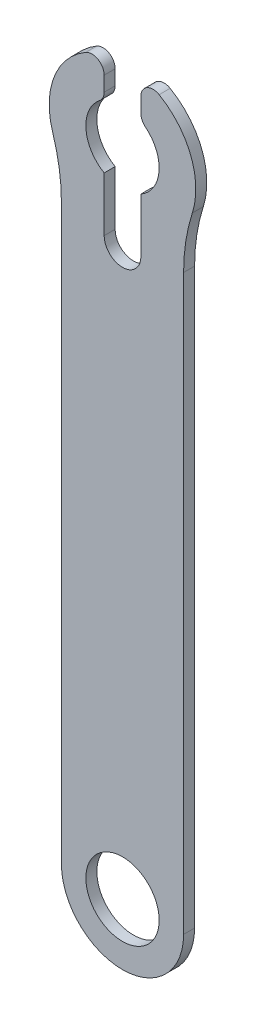
ISO-10303-21;
HEADER;
FILE_DESCRIPTION(('STEP AP214'),'2;1');
FILE_NAME('part.step','',(''),(''),'','','');
FILE_SCHEMA(('AUTOMOTIVE_DESIGN { 1 0 10303 214 1 1 1 1 }'));
ENDSEC;
DATA;
#1=APPLICATION_CONTEXT('core data for automotive mechanical design processes');
#2=APPLICATION_PROTOCOL_DEFINITION('international standard','automotive_design',2000,#1);
#3=PRODUCT_CONTEXT('',#1,'mechanical');
#4=PRODUCT('Part','Part','',(#3));
#5=PRODUCT_RELATED_PRODUCT_CATEGORY('part','',(#4));
#6=PRODUCT_DEFINITION_FORMATION('','',#4);
#7=PRODUCT_DEFINITION_CONTEXT('part definition',#1,'design');
#8=PRODUCT_DEFINITION('design','',#6,#7);
#9=PRODUCT_DEFINITION_SHAPE('','',#8);
#10=(LENGTH_UNIT() NAMED_UNIT(*) SI_UNIT(.MILLI.,.METRE.));
#11=(NAMED_UNIT(*) PLANE_ANGLE_UNIT() SI_UNIT($,.RADIAN.));
#12=(NAMED_UNIT(*) SI_UNIT($,.STERADIAN.) SOLID_ANGLE_UNIT());
#13=UNCERTAINTY_MEASURE_WITH_UNIT(LENGTH_MEASURE(1.E-05),#10,'distance_accuracy_value','');
#14=(GEOMETRIC_REPRESENTATION_CONTEXT(3) GLOBAL_UNCERTAINTY_ASSIGNED_CONTEXT((#13)) GLOBAL_UNIT_ASSIGNED_CONTEXT((#10,
#11,#12)) REPRESENTATION_CONTEXT('',''));
#15=CARTESIAN_POINT('',(0.,0.,0.));
#16=DIRECTION('',(0.,0.,1.));
#17=DIRECTION('',(1.,0.,0.));
#18=AXIS2_PLACEMENT_3D('',#15,#16,#17);
#19=CARTESIAN_POINT('',(0.,-7.04210447024836,0.9));
#20=DIRECTION('',(0.,0.,-1.));
#21=DIRECTION('',(-1.,0.,0.));
#22=AXIS2_PLACEMENT_3D('',#19,#20,#21);
#23=CYLINDRICAL_SURFACE('',#22,1.5);
#24=CARTESIAN_POINT('',(0.,-7.04210447024836,0.));
#25=DIRECTION('',(0.,0.,1.));
#26=DIRECTION('',(1.,0.,0.));
#27=AXIS2_PLACEMENT_3D('',#24,#25,#26);
#28=CIRCLE('',#27,1.5);
#29=CARTESIAN_POINT('',(-1.5,-7.04210447024836,0.));
#30=VERTEX_POINT('',#29);
#31=CARTESIAN_POINT('',(1.5,-7.04210447024836,0.));
#32=VERTEX_POINT('',#31);
#33=EDGE_CURVE('E168',#30,#32,#28,.T.);
#34=ORIENTED_EDGE('',*,*,#33,.F.);
#35=DIRECTION('',(0.,0.,-1.));
#36=VECTOR('',#35,1.);
#37=CARTESIAN_POINT('',(-1.5,-7.04210447024836,0.9));
#38=LINE('',#37,#36);
#39=CARTESIAN_POINT('',(-1.5,-7.04210447024836,0.9));
#40=VERTEX_POINT('',#39);
#41=EDGE_CURVE('E167',#40,#30,#38,.T.);
#42=ORIENTED_EDGE('',*,*,#41,.F.);
#43=CARTESIAN_POINT('',(0.,-7.04210447024836,0.9));
#44=DIRECTION('',(0.,0.,1.));
#45=DIRECTION('',(1.,0.,0.));
#46=AXIS2_PLACEMENT_3D('',#43,#44,#45);
#47=CIRCLE('',#46,1.5);
#48=CARTESIAN_POINT('',(1.5,-7.04210447024836,0.9));
#49=VERTEX_POINT('',#48);
#50=EDGE_CURVE('E169',#40,#49,#47,.T.);
#51=ORIENTED_EDGE('',*,*,#50,.T.);
#52=DIRECTION('',(0.,0.,-1.));
#53=VECTOR('',#52,1.);
#54=CARTESIAN_POINT('',(1.5,-7.04210447024836,0.9));
#55=LINE('',#54,#53);
#56=EDGE_CURVE('E217',#49,#32,#55,.T.);
#57=ORIENTED_EDGE('',*,*,#56,.T.);
#58=EDGE_LOOP('',(#34,#42,#51,#57));
#59=FACE_BOUND('',#58,.T.);
#60=ADVANCED_FACE('F39',(#59),#23,.F.);
#61=CARTESIAN_POINT('',(-1.5,0.,0.9));
#62=DIRECTION('',(1.,0.,0.));
#63=DIRECTION('',(0.,1.,0.));
#64=AXIS2_PLACEMENT_3D('',#61,#62,#63);
#65=PLANE('',#64);
#66=DIRECTION('',(0.,-1.,0.));
#67=VECTOR('',#66,1.);
#68=CARTESIAN_POINT('',(-1.5,0.,0.));
#69=LINE('',#68,#67);
#70=CARTESIAN_POINT('',(-1.5,-2.59807621135332,0.));
#71=VERTEX_POINT('',#70);
#72=EDGE_CURVE('E219',#71,#30,#69,.T.);
#73=ORIENTED_EDGE('',*,*,#72,.F.);
#74=DIRECTION('',(0.,0.,-1.));
#75=VECTOR('',#74,1.);
#76=CARTESIAN_POINT('',(-1.5,-2.59807621135332,0.9));
#77=LINE('',#76,#75);
#78=CARTESIAN_POINT('',(-1.5,-2.59807621135332,0.9));
#79=VERTEX_POINT('',#78);
#80=EDGE_CURVE('E176',#79,#71,#77,.T.);
#81=ORIENTED_EDGE('',*,*,#80,.F.);
#82=DIRECTION('',(0.,-1.,0.));
#83=VECTOR('',#82,1.);
#84=CARTESIAN_POINT('',(-1.5,0.,0.9));
#85=LINE('',#84,#83);
#86=EDGE_CURVE('E181',#79,#40,#85,.T.);
#87=ORIENTED_EDGE('',*,*,#86,.T.);
#88=ORIENTED_EDGE('',*,*,#41,.T.);
#89=EDGE_LOOP('',(#73,#81,#87,#88));
#90=FACE_BOUND('',#89,.T.);
#91=ADVANCED_FACE('F191',(#90),#65,.T.);
#92=CARTESIAN_POINT('',(0.,0.,0.9));
#93=DIRECTION('',(0.,0.,-1.));
#94=DIRECTION('',(-1.,0.,0.));
#95=AXIS2_PLACEMENT_3D('',#92,#93,#94);
#96=CYLINDRICAL_SURFACE('',#95,3.);
#97=CARTESIAN_POINT('',(0.,0.,0.));
#98=DIRECTION('',(0.,0.,1.));
#99=DIRECTION('',(1.,0.,0.));
#100=AXIS2_PLACEMENT_3D('',#97,#98,#99);
#101=CIRCLE('',#100,3.);
#102=CARTESIAN_POINT('',(-1.875,2.3418742493994,0.));
#103=VERTEX_POINT('',#102);
#104=EDGE_CURVE('E225',#103,#71,#101,.T.);
#105=ORIENTED_EDGE('',*,*,#104,.F.);
#106=DIRECTION('',(0.,0.,-1.));
#107=VECTOR('',#106,1.);
#108=CARTESIAN_POINT('',(-1.875,2.3418742493994,0.9));
#109=LINE('',#108,#107);
#110=CARTESIAN_POINT('',(-1.875,2.3418742493994,0.9));
#111=VERTEX_POINT('',#110);
#112=EDGE_CURVE('E303',#103,#111,#109,.F.);
#113=ORIENTED_EDGE('',*,*,#112,.T.);
#114=CARTESIAN_POINT('',(0.,0.,0.9));
#115=DIRECTION('',(0.,0.,1.));
#116=DIRECTION('',(1.,0.,0.));
#117=AXIS2_PLACEMENT_3D('',#114,#115,#116);
#118=CIRCLE('',#117,3.);
#119=EDGE_CURVE('E192',#111,#79,#118,.T.);
#120=ORIENTED_EDGE('',*,*,#119,.T.);
#121=ORIENTED_EDGE('',*,*,#80,.T.);
#122=EDGE_LOOP('',(#105,#113,#120,#121));
#123=FACE_BOUND('',#122,.T.);
#124=ADVANCED_FACE('F306',(#123),#96,.F.);
#125=CARTESIAN_POINT('',(-1.5,0.,0.9));
#126=DIRECTION('',(1.,0.,0.));
#127=DIRECTION('',(0.,1.,0.));
#128=AXIS2_PLACEMENT_3D('',#125,#126,#127);
#129=PLANE('',#128);
#130=DIRECTION('',(0.,-1.,0.));
#131=VECTOR('',#130,1.);
#132=CARTESIAN_POINT('',(-1.5,0.,0.9));
#133=LINE('',#132,#131);
#134=CARTESIAN_POINT('',(-1.5,4.3301270189222,0.9));
#135=VERTEX_POINT('',#134);
#136=CARTESIAN_POINT('',(-1.5,3.1224989991992,0.9));
#137=VERTEX_POINT('',#136);
#138=EDGE_CURVE('E194',#135,#137,#133,.T.);
#139=ORIENTED_EDGE('',*,*,#138,.T.);
#140=DIRECTION('',(0.,0.,-1.));
#141=VECTOR('',#140,1.);
#142=CARTESIAN_POINT('',(-1.5,3.1224989991992,0.9));
#143=LINE('',#142,#141);
#144=CARTESIAN_POINT('',(-1.5,3.1224989991992,0.));
#145=VERTEX_POINT('',#144);
#146=EDGE_CURVE('E301',#137,#145,#143,.T.);
#147=ORIENTED_EDGE('',*,*,#146,.T.);
#148=DIRECTION('',(0.,-1.,0.));
#149=VECTOR('',#148,1.);
#150=CARTESIAN_POINT('',(-1.5,0.,0.));
#151=LINE('',#150,#149);
#152=CARTESIAN_POINT('',(-1.5,4.3301270189222,0.));
#153=VERTEX_POINT('',#152);
#154=EDGE_CURVE('E221',#153,#145,#151,.T.);
#155=ORIENTED_EDGE('',*,*,#154,.F.);
#156=DIRECTION('',(0.,0.,1.));
#157=VECTOR('',#156,1.);
#158=CARTESIAN_POINT('',(-1.5,4.3301270189222,0.9));
#159=LINE('',#158,#157);
#160=EDGE_CURVE('E296',#153,#135,#159,.T.);
#161=ORIENTED_EDGE('',*,*,#160,.T.);
#162=EDGE_LOOP('',(#139,#147,#155,#161));
#163=FACE_BOUND('',#162,.T.);
#164=ADVANCED_FACE('F312',(#163),#129,.T.);
#165=CARTESIAN_POINT('',(0.,0.,0.9));
#166=DIRECTION('',(0.,0.,-1.));
#167=DIRECTION('',(-1.,0.,0.));
#168=AXIS2_PLACEMENT_3D('',#165,#166,#167);
#169=CYLINDRICAL_SURFACE('',#168,6.);
#170=CARTESIAN_POINT('',(0.,0.,0.9));
#171=DIRECTION('',(0.,0.,1.));
#172=DIRECTION('',(1.,0.,0.));
#173=AXIS2_PLACEMENT_3D('',#170,#171,#172);
#174=CIRCLE('',#173,6.);
#175=CARTESIAN_POINT('',(-3.,5.19615242270663,0.9));
#176=VERTEX_POINT('',#175);
#177=CARTESIAN_POINT('',(-5.71428571428572,-1.82946406783796,0.9));
#178=VERTEX_POINT('',#177);
#179=EDGE_CURVE('E203',#176,#178,#174,.T.);
#180=ORIENTED_EDGE('',*,*,#179,.F.);
#181=DIRECTION('',(0.,0.,-1.));
#182=VECTOR('',#181,1.);
#183=CARTESIAN_POINT('',(-3.,5.19615242270663,0.9));
#184=LINE('',#183,#182);
#185=CARTESIAN_POINT('',(-3.,5.19615242270663,0.));
#186=VERTEX_POINT('',#185);
#187=EDGE_CURVE('E11',#176,#186,#184,.T.);
#188=ORIENTED_EDGE('',*,*,#187,.T.);
#189=CARTESIAN_POINT('',(0.,0.,0.));
#190=DIRECTION('',(0.,0.,1.));
#191=DIRECTION('',(1.,0.,0.));
#192=AXIS2_PLACEMENT_3D('',#189,#190,#191);
#193=CIRCLE('',#192,6.);
#194=CARTESIAN_POINT('',(-5.71428571428572,-1.82946406783796,0.));
#195=VERTEX_POINT('',#194);
#196=EDGE_CURVE('E230',#186,#195,#193,.T.);
#197=ORIENTED_EDGE('',*,*,#196,.T.);
#198=DIRECTION('',(0.,0.,-1.));
#199=VECTOR('',#198,1.);
#200=CARTESIAN_POINT('',(-5.71428571428572,-1.82946406783796,0.9));
#201=LINE('',#200,#199);
#202=EDGE_CURVE('E262',#195,#178,#201,.F.);
#203=ORIENTED_EDGE('',*,*,#202,.T.);
#204=EDGE_LOOP('',(#180,#188,#197,#203));
#205=FACE_BOUND('',#204,.T.);
#206=ADVANCED_FACE('F324',(#205),#169,.T.);
#207=CARTESIAN_POINT('',(-5.,0.,0.9));
#208=DIRECTION('',(1.,0.,0.));
#209=DIRECTION('',(0.,1.,0.));
#210=AXIS2_PLACEMENT_3D('',#207,#208,#209);
#211=PLANE('',#210);
#212=DIRECTION('',(0.,-1.,0.));
#213=VECTOR('',#212,1.);
#214=CARTESIAN_POINT('',(-5.,0.,0.9));
#215=LINE('',#214,#213);
#216=CARTESIAN_POINT('',(-5.,-6.40312423743285,0.9));
#217=VERTEX_POINT('',#216);
#218=CARTESIAN_POINT('',(-4.99999999999999,-53.3166247903554,0.9));
#219=VERTEX_POINT('',#218);
#220=EDGE_CURVE('E201',#217,#219,#215,.T.);
#221=ORIENTED_EDGE('',*,*,#220,.F.);
#222=DIRECTION('',(0.,0.,1.));
#223=VECTOR('',#222,1.);
#224=CARTESIAN_POINT('',(-5.,-6.40312423743285,0.));
#225=LINE('',#224,#223);
#226=CARTESIAN_POINT('',(-5.,-6.40312423743285,0.));
#227=VERTEX_POINT('',#226);
#228=EDGE_CURVE('E261',#217,#227,#225,.F.);
#229=ORIENTED_EDGE('',*,*,#228,.T.);
#230=DIRECTION('',(0.,-1.,0.));
#231=VECTOR('',#230,1.);
#232=CARTESIAN_POINT('',(-5.,0.,0.));
#233=LINE('',#232,#231);
#234=CARTESIAN_POINT('',(-4.99999999999999,-53.3166247903554,0.));
#235=VERTEX_POINT('',#234);
#236=EDGE_CURVE('E228',#227,#235,#233,.T.);
#237=ORIENTED_EDGE('',*,*,#236,.T.);
#238=DIRECTION('',(0.,0.,-1.));
#239=VECTOR('',#238,1.);
#240=CARTESIAN_POINT('',(-4.99999999999999,-53.3166247903554,0.9));
#241=LINE('',#240,#239);
#242=EDGE_CURVE('E251',#219,#235,#241,.T.);
#243=ORIENTED_EDGE('',*,*,#242,.F.);
#244=EDGE_LOOP('',(#221,#229,#237,#243));
#245=FACE_BOUND('',#244,.T.);
#246=ADVANCED_FACE('F334',(#245),#211,.F.);
#247=CARTESIAN_POINT('',(0.,-53.3166247903554,0.9));
#248=DIRECTION('',(0.,0.,-1.));
#249=DIRECTION('',(-1.,0.,0.));
#250=AXIS2_PLACEMENT_3D('',#247,#248,#249);
#251=CYLINDRICAL_SURFACE('',#250,4.99999999999999);
#252=CARTESIAN_POINT('',(0.,-53.3166247903554,0.));
#253=DIRECTION('',(0.,0.,1.));
#254=DIRECTION('',(1.,0.,0.));
#255=AXIS2_PLACEMENT_3D('',#252,#253,#254);
#256=CIRCLE('',#255,4.99999999999999);
#257=CARTESIAN_POINT('',(4.99999999999999,-53.3166247903554,0.));
#258=VERTEX_POINT('',#257);
#259=EDGE_CURVE('E235',#235,#258,#256,.T.);
#260=ORIENTED_EDGE('',*,*,#259,.T.);
#261=DIRECTION('',(0.,0.,-1.));
#262=VECTOR('',#261,1.);
#263=CARTESIAN_POINT('',(4.99999999999999,-53.3166247903554,0.9));
#264=LINE('',#263,#262);
#265=CARTESIAN_POINT('',(4.99999999999999,-53.3166247903554,0.9));
#266=VERTEX_POINT('',#265);
#267=EDGE_CURVE('E249',#266,#258,#264,.T.);
#268=ORIENTED_EDGE('',*,*,#267,.F.);
#269=CARTESIAN_POINT('',(0.,-53.3166247903554,0.9));
#270=DIRECTION('',(0.,0.,1.));
#271=DIRECTION('',(1.,0.,0.));
#272=AXIS2_PLACEMENT_3D('',#269,#270,#271);
#273=CIRCLE('',#272,4.99999999999999);
#274=EDGE_CURVE('E202',#219,#266,#273,.T.);
#275=ORIENTED_EDGE('',*,*,#274,.F.);
#276=ORIENTED_EDGE('',*,*,#242,.T.);
#277=EDGE_LOOP('',(#260,#268,#275,#276));
#278=FACE_BOUND('',#277,.T.);
#279=ADVANCED_FACE('F336',(#278),#251,.T.);
#280=CARTESIAN_POINT('',(5.,0.,0.9));
#281=DIRECTION('',(1.,0.,0.));
#282=DIRECTION('',(0.,1.,0.));
#283=AXIS2_PLACEMENT_3D('',#280,#281,#282);
#284=PLANE('',#283);
#285=DIRECTION('',(0.,-1.,0.));
#286=VECTOR('',#285,1.);
#287=CARTESIAN_POINT('',(5.,0.,0.));
#288=LINE('',#287,#286);
#289=CARTESIAN_POINT('',(5.,-6.40312423743284,0.));
#290=VERTEX_POINT('',#289);
#291=EDGE_CURVE('E234',#290,#258,#288,.T.);
#292=ORIENTED_EDGE('',*,*,#291,.F.);
#293=DIRECTION('',(0.,0.,-1.));
#294=VECTOR('',#293,1.);
#295=CARTESIAN_POINT('',(5.,-6.40312423743284,0.9));
#296=LINE('',#295,#294);
#297=CARTESIAN_POINT('',(5.,-6.40312423743284,0.9));
#298=VERTEX_POINT('',#297);
#299=EDGE_CURVE('E259',#290,#298,#296,.F.);
#300=ORIENTED_EDGE('',*,*,#299,.T.);
#301=DIRECTION('',(0.,-1.,0.));
#302=VECTOR('',#301,1.);
#303=CARTESIAN_POINT('',(5.,0.,0.9));
#304=LINE('',#303,#302);
#305=EDGE_CURVE('E208',#298,#266,#304,.T.);
#306=ORIENTED_EDGE('',*,*,#305,.T.);
#307=ORIENTED_EDGE('',*,*,#267,.T.);
#308=EDGE_LOOP('',(#292,#300,#306,#307));
#309=FACE_BOUND('',#308,.T.);
#310=ADVANCED_FACE('F482',(#309),#284,.T.);
#311=CARTESIAN_POINT('',(0.,0.,0.9));
#312=DIRECTION('',(0.,0.,-1.));
#313=DIRECTION('',(-1.,0.,0.));
#314=AXIS2_PLACEMENT_3D('',#311,#312,#313);
#315=CYLINDRICAL_SURFACE('',#314,6.);
#316=CARTESIAN_POINT('',(0.,0.,0.));
#317=DIRECTION('',(0.,0.,1.));
#318=DIRECTION('',(1.,0.,0.));
#319=AXIS2_PLACEMENT_3D('',#316,#317,#318);
#320=CIRCLE('',#319,6.);
#321=CARTESIAN_POINT('',(5.71428571428571,-1.82946406783796,0.));
#322=VERTEX_POINT('',#321);
#323=CARTESIAN_POINT('',(3.,5.19615242270663,0.));
#324=VERTEX_POINT('',#323);
#325=EDGE_CURVE('E240',#322,#324,#320,.T.);
#326=ORIENTED_EDGE('',*,*,#325,.T.);
#327=DIRECTION('',(0.,0.,-1.));
#328=VECTOR('',#327,1.);
#329=CARTESIAN_POINT('',(3.,5.19615242270663,0.9));
#330=LINE('',#329,#328);
#331=CARTESIAN_POINT('',(3.,5.19615242270663,0.9));
#332=VERTEX_POINT('',#331);
#333=EDGE_CURVE('E50',#324,#332,#330,.F.);
#334=ORIENTED_EDGE('',*,*,#333,.T.);
#335=CARTESIAN_POINT('',(0.,0.,0.9));
#336=DIRECTION('',(0.,0.,1.));
#337=DIRECTION('',(1.,0.,0.));
#338=AXIS2_PLACEMENT_3D('',#335,#336,#337);
#339=CIRCLE('',#338,6.);
#340=CARTESIAN_POINT('',(5.71428571428571,-1.82946406783796,0.9));
#341=VERTEX_POINT('',#340);
#342=EDGE_CURVE('E209',#341,#332,#339,.T.);
#343=ORIENTED_EDGE('',*,*,#342,.F.);
#344=DIRECTION('',(0.,0.,-1.));
#345=VECTOR('',#344,1.);
#346=CARTESIAN_POINT('',(5.71428571428571,-1.82946406783796,0.9));
#347=LINE('',#346,#345);
#348=EDGE_CURVE('E173',#341,#322,#347,.T.);
#349=ORIENTED_EDGE('',*,*,#348,.T.);
#350=EDGE_LOOP('',(#326,#334,#343,#349));
#351=FACE_BOUND('',#350,.T.);
#352=ADVANCED_FACE('F349',(#351),#315,.T.);
#353=CARTESIAN_POINT('',(1.5,0.,0.9));
#354=DIRECTION('',(1.,0.,0.));
#355=DIRECTION('',(0.,1.,0.));
#356=AXIS2_PLACEMENT_3D('',#353,#354,#355);
#357=PLANE('',#356);
#358=DIRECTION('',(0.,-1.,0.));
#359=VECTOR('',#358,1.);
#360=CARTESIAN_POINT('',(1.5,0.,0.));
#361=LINE('',#360,#359);
#362=CARTESIAN_POINT('',(1.5,4.33012701892219,0.));
#363=VERTEX_POINT('',#362);
#364=CARTESIAN_POINT('',(1.5,3.1224989991992,0.));
#365=VERTEX_POINT('',#364);
#366=EDGE_CURVE('E239',#363,#365,#361,.T.);
#367=ORIENTED_EDGE('',*,*,#366,.T.);
#368=DIRECTION('',(0.,0.,1.));
#369=VECTOR('',#368,1.);
#370=CARTESIAN_POINT('',(1.5,3.1224989991992,0.9));
#371=LINE('',#370,#369);
#372=CARTESIAN_POINT('',(1.5,3.1224989991992,0.9));
#373=VERTEX_POINT('',#372);
#374=EDGE_CURVE('E289',#365,#373,#371,.T.);
#375=ORIENTED_EDGE('',*,*,#374,.T.);
#376=DIRECTION('',(0.,-1.,0.));
#377=VECTOR('',#376,1.);
#378=CARTESIAN_POINT('',(1.5,0.,0.9));
#379=LINE('',#378,#377);
#380=CARTESIAN_POINT('',(1.5,4.33012701892219,0.9));
#381=VERTEX_POINT('',#380);
#382=EDGE_CURVE('E215',#381,#373,#379,.T.);
#383=ORIENTED_EDGE('',*,*,#382,.F.);
#384=DIRECTION('',(0.,0.,-1.));
#385=VECTOR('',#384,1.);
#386=CARTESIAN_POINT('',(1.5,4.33012701892219,0.9));
#387=LINE('',#386,#385);
#388=EDGE_CURVE('E290',#381,#363,#387,.T.);
#389=ORIENTED_EDGE('',*,*,#388,.T.);
#390=EDGE_LOOP('',(#367,#375,#383,#389));
#391=FACE_BOUND('',#390,.T.);
#392=ADVANCED_FACE('F357',(#391),#357,.F.);
#393=CARTESIAN_POINT('',(1.5,-2.59807621135332,0.9));
#394=VERTEX_POINT('',#393);
#395=CARTESIAN_POINT('',(1.875,2.3418742493994,0.9));
#396=VERTEX_POINT('',#395);
#397=EDGE_CURVE('E197',#394,#396,#118,.T.);
#398=ORIENTED_EDGE('',*,*,#397,.T.);
#399=DIRECTION('',(0.,0.,-1.));
#400=VECTOR('',#399,1.);
#401=CARTESIAN_POINT('',(1.875,2.3418742493994,0.9));
#402=LINE('',#401,#400);
#403=CARTESIAN_POINT('',(1.875,2.3418742493994,0.));
#404=VERTEX_POINT('',#403);
#405=EDGE_CURVE('E277',#396,#404,#402,.T.);
#406=ORIENTED_EDGE('',*,*,#405,.T.);
#407=CARTESIAN_POINT('',(1.5,-2.59807621135332,0.));
#408=VERTEX_POINT('',#407);
#409=EDGE_CURVE('E223',#408,#404,#101,.T.);
#410=ORIENTED_EDGE('',*,*,#409,.F.);
#411=DIRECTION('',(0.,0.,-1.));
#412=VECTOR('',#411,1.);
#413=CARTESIAN_POINT('',(1.5,-2.59807621135332,0.9));
#414=LINE('',#413,#412);
#415=EDGE_CURVE('E247',#394,#408,#414,.T.);
#416=ORIENTED_EDGE('',*,*,#415,.F.);
#417=EDGE_LOOP('',(#398,#406,#410,#416));
#418=FACE_BOUND('',#417,.T.);
#419=ADVANCED_FACE('F370',(#418),#96,.F.);
#420=CARTESIAN_POINT('',(1.5,0.,0.9));
#421=DIRECTION('',(1.,0.,0.));
#422=DIRECTION('',(0.,1.,0.));
#423=AXIS2_PLACEMENT_3D('',#420,#421,#422);
#424=PLANE('',#423);
#425=DIRECTION('',(0.,-1.,0.));
#426=VECTOR('',#425,1.);
#427=CARTESIAN_POINT('',(1.5,0.,0.));
#428=LINE('',#427,#426);
#429=EDGE_CURVE('E244',#408,#32,#428,.T.);
#430=ORIENTED_EDGE('',*,*,#429,.T.);
#431=ORIENTED_EDGE('',*,*,#56,.F.);
#432=DIRECTION('',(0.,-1.,0.));
#433=VECTOR('',#432,1.);
#434=CARTESIAN_POINT('',(1.5,0.,0.9));
#435=LINE('',#434,#433);
#436=EDGE_CURVE('E187',#394,#49,#435,.T.);
#437=ORIENTED_EDGE('',*,*,#436,.F.);
#438=ORIENTED_EDGE('',*,*,#415,.T.);
#439=EDGE_LOOP('',(#430,#431,#437,#438));
#440=FACE_BOUND('',#439,.T.);
#441=ADVANCED_FACE('F367',(#440),#424,.F.);
#442=CARTESIAN_POINT('',(0.,-53.3166247903554,0.9));
#443=DIRECTION('',(0.,0.,-1.));
#444=DIRECTION('',(-1.,0.,0.));
#445=AXIS2_PLACEMENT_3D('',#442,#443,#444);
#446=CYLINDRICAL_SURFACE('',#445,3.);
#447=CARTESIAN_POINT('',(0.,-53.3166247903554,0.9));
#448=DIRECTION('',(0.,0.,1.));
#449=DIRECTION('',(1.,0.,0.));
#450=AXIS2_PLACEMENT_3D('',#447,#448,#449);
#451=CIRCLE('',#450,3.);
#452=CARTESIAN_POINT('',(3.,-53.3166247903554,0.9));
#453=VERTEX_POINT('',#452);
#454=EDGE_CURVE('E214',#453,#453,#451,.T.);
#455=ORIENTED_EDGE('',*,*,#454,.T.);
#456=EDGE_LOOP('',(#455));
#457=FACE_BOUND('',#456,.T.);
#458=CARTESIAN_POINT('',(0.,-53.3166247903554,0.));
#459=DIRECTION('',(0.,0.,1.));
#460=DIRECTION('',(1.,0.,0.));
#461=AXIS2_PLACEMENT_3D('',#458,#459,#460);
#462=CIRCLE('',#461,3.);
#463=CARTESIAN_POINT('',(3.,-53.3166247903554,0.));
#464=VERTEX_POINT('',#463);
#465=EDGE_CURVE('E190',#464,#464,#462,.T.);
#466=ORIENTED_EDGE('',*,*,#465,.F.);
#467=EDGE_LOOP('',(#466));
#468=FACE_BOUND('',#467,.T.);
#469=ADVANCED_FACE('F375',(#457,#468),#446,.F.);
#470=CARTESIAN_POINT('',(0.,0.,0.9));
#471=DIRECTION('',(0.,0.,1.));
#472=DIRECTION('',(1.,0.,0.));
#473=AXIS2_PLACEMENT_3D('',#470,#471,#472);
#474=PLANE('',#473);
#475=ORIENTED_EDGE('',*,*,#382,.T.);
#476=CARTESIAN_POINT('',(2.5,3.1224989991992,0.9));
#477=DIRECTION('',(0.,0.,1.));
#478=DIRECTION('',(1.,0.,0.));
#479=AXIS2_PLACEMENT_3D('',#476,#477,#478);
#480=CIRCLE('',#479,1.);
#481=EDGE_CURVE('E299',#373,#396,#480,.T.);
#482=ORIENTED_EDGE('',*,*,#481,.T.);
#483=ORIENTED_EDGE('',*,*,#397,.F.);
#484=ORIENTED_EDGE('',*,*,#436,.T.);
#485=ORIENTED_EDGE('',*,*,#50,.F.);
#486=ORIENTED_EDGE('',*,*,#86,.F.);
#487=ORIENTED_EDGE('',*,*,#119,.F.);
#488=CARTESIAN_POINT('',(-2.5,3.1224989991992,0.9));
#489=DIRECTION('',(0.,0.,1.));
#490=DIRECTION('',(1.,0.,0.));
#491=AXIS2_PLACEMENT_3D('',#488,#489,#490);
#492=CIRCLE('',#491,1.);
#493=EDGE_CURVE('E293',#111,#137,#492,.T.);
#494=ORIENTED_EDGE('',*,*,#493,.T.);
#495=ORIENTED_EDGE('',*,*,#138,.F.);
#496=CARTESIAN_POINT('',(-2.5,4.3301270189222,0.9));
#497=DIRECTION('',(0.,0.,1.));
#498=DIRECTION('',(1.,0.,0.));
#499=AXIS2_PLACEMENT_3D('',#496,#497,#498);
#500=CIRCLE('',#499,1.);
#501=EDGE_CURVE('E62',#135,#176,#500,.T.);
#502=ORIENTED_EDGE('',*,*,#501,.T.);
#503=ORIENTED_EDGE('',*,*,#179,.T.);
#504=CARTESIAN_POINT('',(-20.,-6.40312423743285,0.9));
#505=DIRECTION('',(0.,0.,1.));
#506=DIRECTION('',(1.,0.,0.));
#507=AXIS2_PLACEMENT_3D('',#504,#505,#506);
#508=CIRCLE('',#507,15.);
#509=EDGE_CURVE('E273',#178,#217,#508,.F.);
#510=ORIENTED_EDGE('',*,*,#509,.T.);
#511=ORIENTED_EDGE('',*,*,#220,.T.);
#512=ORIENTED_EDGE('',*,*,#274,.T.);
#513=ORIENTED_EDGE('',*,*,#305,.F.);
#514=CARTESIAN_POINT('',(20.,-6.40312423743285,0.9));
#515=DIRECTION('',(0.,0.,1.));
#516=DIRECTION('',(1.,0.,0.));
#517=AXIS2_PLACEMENT_3D('',#514,#515,#516);
#518=CIRCLE('',#517,15.);
#519=EDGE_CURVE('E267',#298,#341,#518,.F.);
#520=ORIENTED_EDGE('',*,*,#519,.T.);
#521=ORIENTED_EDGE('',*,*,#342,.T.);
#522=CARTESIAN_POINT('',(2.5,4.33012701892219,0.9));
#523=DIRECTION('',(0.,0.,1.));
#524=DIRECTION('',(1.,0.,0.));
#525=AXIS2_PLACEMENT_3D('',#522,#523,#524);
#526=CIRCLE('',#525,1.);
#527=EDGE_CURVE('E291',#332,#381,#526,.T.);
#528=ORIENTED_EDGE('',*,*,#527,.T.);
#529=EDGE_LOOP('',(#475,#482,#483,#484,#485,#486,#487,#494,#495,#502,#503,#510,#511,#512,#513,
#520,#521,#528));
#530=FACE_BOUND('',#529,.T.);
#531=ORIENTED_EDGE('',*,*,#454,.F.);
#532=EDGE_LOOP('',(#531));
#533=FACE_BOUND('',#532,.T.);
#534=ADVANCED_FACE('F179',(#530,#533),#474,.T.);
#535=CARTESIAN_POINT('',(0.,0.,0.));
#536=DIRECTION('',(0.,0.,1.));
#537=DIRECTION('',(1.,0.,0.));
#538=AXIS2_PLACEMENT_3D('',#535,#536,#537);
#539=PLANE('',#538);
#540=ORIENTED_EDGE('',*,*,#409,.T.);
#541=CARTESIAN_POINT('',(2.5,3.1224989991992,0.));
#542=DIRECTION('',(0.,0.,1.));
#543=DIRECTION('',(1.,0.,0.));
#544=AXIS2_PLACEMENT_3D('',#541,#542,#543);
#545=CIRCLE('',#544,1.);
#546=EDGE_CURVE('E283',#404,#365,#545,.F.);
#547=ORIENTED_EDGE('',*,*,#546,.T.);
#548=ORIENTED_EDGE('',*,*,#366,.F.);
#549=CARTESIAN_POINT('',(2.5,4.33012701892219,0.));
#550=DIRECTION('',(0.,0.,1.));
#551=DIRECTION('',(1.,0.,0.));
#552=AXIS2_PLACEMENT_3D('',#549,#550,#551);
#553=CIRCLE('',#552,1.);
#554=EDGE_CURVE('E282',#363,#324,#553,.F.);
#555=ORIENTED_EDGE('',*,*,#554,.T.);
#556=ORIENTED_EDGE('',*,*,#325,.F.);
#557=CARTESIAN_POINT('',(20.,-6.40312423743285,0.));
#558=DIRECTION('',(0.,0.,1.));
#559=DIRECTION('',(1.,0.,0.));
#560=AXIS2_PLACEMENT_3D('',#557,#558,#559);
#561=CIRCLE('',#560,15.);
#562=EDGE_CURVE('E270',#322,#290,#561,.T.);
#563=ORIENTED_EDGE('',*,*,#562,.T.);
#564=ORIENTED_EDGE('',*,*,#291,.T.);
#565=ORIENTED_EDGE('',*,*,#259,.F.);
#566=ORIENTED_EDGE('',*,*,#236,.F.);
#567=CARTESIAN_POINT('',(-20.,-6.40312423743285,0.));
#568=DIRECTION('',(0.,0.,1.));
#569=DIRECTION('',(1.,0.,0.));
#570=AXIS2_PLACEMENT_3D('',#567,#568,#569);
#571=CIRCLE('',#570,15.);
#572=EDGE_CURVE('E271',#227,#195,#571,.T.);
#573=ORIENTED_EDGE('',*,*,#572,.T.);
#574=ORIENTED_EDGE('',*,*,#196,.F.);
#575=CARTESIAN_POINT('',(-2.5,4.3301270189222,0.));
#576=DIRECTION('',(0.,0.,1.));
#577=DIRECTION('',(1.,0.,0.));
#578=AXIS2_PLACEMENT_3D('',#575,#576,#577);
#579=CIRCLE('',#578,1.);
#580=EDGE_CURVE('E276',#186,#153,#579,.F.);
#581=ORIENTED_EDGE('',*,*,#580,.T.);
#582=ORIENTED_EDGE('',*,*,#154,.T.);
#583=CARTESIAN_POINT('',(-2.5,3.1224989991992,0.));
#584=DIRECTION('',(0.,0.,1.));
#585=DIRECTION('',(1.,0.,0.));
#586=AXIS2_PLACEMENT_3D('',#583,#584,#585);
#587=CIRCLE('',#586,1.);
#588=EDGE_CURVE('E285',#145,#103,#587,.F.);
#589=ORIENTED_EDGE('',*,*,#588,.T.);
#590=ORIENTED_EDGE('',*,*,#104,.T.);
#591=ORIENTED_EDGE('',*,*,#72,.T.);
#592=ORIENTED_EDGE('',*,*,#33,.T.);
#593=ORIENTED_EDGE('',*,*,#429,.F.);
#594=EDGE_LOOP('',(#540,#547,#548,#555,#556,#563,#564,#565,#566,#573,#574,#581,#582,#589,#590,
#591,#592,#593));
#595=FACE_BOUND('',#594,.T.);
#596=ORIENTED_EDGE('',*,*,#465,.T.);
#597=EDGE_LOOP('',(#596));
#598=FACE_BOUND('',#597,.T.);
#599=ADVANCED_FACE('F317',(#595,#598),#539,.F.);
#600=CARTESIAN_POINT('',(20.,-6.40312423743285,0.9));
#601=DIRECTION('',(0.,0.,-1.));
#602=DIRECTION('',(-1.,0.,0.));
#603=AXIS2_PLACEMENT_3D('',#600,#601,#602);
#604=CYLINDRICAL_SURFACE('',#603,15.);
#605=ORIENTED_EDGE('',*,*,#519,.F.);
#606=ORIENTED_EDGE('',*,*,#299,.F.);
#607=ORIENTED_EDGE('',*,*,#562,.F.);
#608=ORIENTED_EDGE('',*,*,#348,.F.);
#609=EDGE_LOOP('',(#605,#606,#607,#608));
#610=FACE_BOUND('',#609,.T.);
#611=ADVANCED_FACE('F350',(#610),#604,.F.);
#612=CARTESIAN_POINT('',(-20.,-6.40312423743285,0.9));
#613=DIRECTION('',(0.,0.,-1.));
#614=DIRECTION('',(-1.,0.,0.));
#615=AXIS2_PLACEMENT_3D('',#612,#613,#614);
#616=CYLINDRICAL_SURFACE('',#615,15.);
#617=ORIENTED_EDGE('',*,*,#509,.F.);
#618=ORIENTED_EDGE('',*,*,#202,.F.);
#619=ORIENTED_EDGE('',*,*,#572,.F.);
#620=ORIENTED_EDGE('',*,*,#228,.F.);
#621=EDGE_LOOP('',(#617,#618,#619,#620));
#622=FACE_BOUND('',#621,.T.);
#623=ADVANCED_FACE('F337',(#622),#616,.F.);
#624=CARTESIAN_POINT('',(2.5,3.1224989991992,0.9));
#625=DIRECTION('',(0.,0.,-1.));
#626=DIRECTION('',(-1.,0.,0.));
#627=AXIS2_PLACEMENT_3D('',#624,#625,#626);
#628=CYLINDRICAL_SURFACE('',#627,1.);
#629=ORIENTED_EDGE('',*,*,#481,.F.);
#630=ORIENTED_EDGE('',*,*,#374,.F.);
#631=ORIENTED_EDGE('',*,*,#546,.F.);
#632=ORIENTED_EDGE('',*,*,#405,.F.);
#633=EDGE_LOOP('',(#629,#630,#631,#632));
#634=FACE_BOUND('',#633,.T.);
#635=ADVANCED_FACE('F365',(#634),#628,.T.);
#636=CARTESIAN_POINT('',(-2.5,3.1224989991992,0.9));
#637=DIRECTION('',(0.,0.,-1.));
#638=DIRECTION('',(-1.,0.,0.));
#639=AXIS2_PLACEMENT_3D('',#636,#637,#638);
#640=CYLINDRICAL_SURFACE('',#639,1.);
#641=ORIENTED_EDGE('',*,*,#493,.F.);
#642=ORIENTED_EDGE('',*,*,#112,.F.);
#643=ORIENTED_EDGE('',*,*,#588,.F.);
#644=ORIENTED_EDGE('',*,*,#146,.F.);
#645=EDGE_LOOP('',(#641,#642,#643,#644));
#646=FACE_BOUND('',#645,.T.);
#647=ADVANCED_FACE('F315',(#646),#640,.T.);
#648=CARTESIAN_POINT('',(2.5,4.33012701892219,0.9));
#649=DIRECTION('',(0.,0.,-1.));
#650=DIRECTION('',(-1.,0.,0.));
#651=AXIS2_PLACEMENT_3D('',#648,#649,#650);
#652=CYLINDRICAL_SURFACE('',#651,1.);
#653=ORIENTED_EDGE('',*,*,#527,.F.);
#654=ORIENTED_EDGE('',*,*,#333,.F.);
#655=ORIENTED_EDGE('',*,*,#554,.F.);
#656=ORIENTED_EDGE('',*,*,#388,.F.);
#657=EDGE_LOOP('',(#653,#654,#655,#656));
#658=FACE_BOUND('',#657,.T.);
#659=ADVANCED_FACE('F353',(#658),#652,.T.);
#660=CARTESIAN_POINT('',(-2.5,4.3301270189222,0.9));
#661=DIRECTION('',(0.,0.,-1.));
#662=DIRECTION('',(-1.,0.,0.));
#663=AXIS2_PLACEMENT_3D('',#660,#661,#662);
#664=CYLINDRICAL_SURFACE('',#663,1.);
#665=ORIENTED_EDGE('',*,*,#501,.F.);
#666=ORIENTED_EDGE('',*,*,#160,.F.);
#667=ORIENTED_EDGE('',*,*,#580,.F.);
#668=ORIENTED_EDGE('',*,*,#187,.F.);
#669=EDGE_LOOP('',(#665,#666,#667,#668));
#670=FACE_BOUND('',#669,.T.);
#671=ADVANCED_FACE('F41',(#670),#664,.T.);
#672=CLOSED_SHELL('',(#60,#91,#124,#164,#206,#246,#279,#310,#352,#392,#419,#441,#469,#534,#599,
#611,#623,#635,#647,#659,#671));
#673=MANIFOLD_SOLID_BREP('B2',#672);
#674=ADVANCED_BREP_SHAPE_REPRESENTATION('',(#18,#673),#14);
#675=SHAPE_DEFINITION_REPRESENTATION(#9,#674);
ENDSEC;
END-ISO-10303-21;
